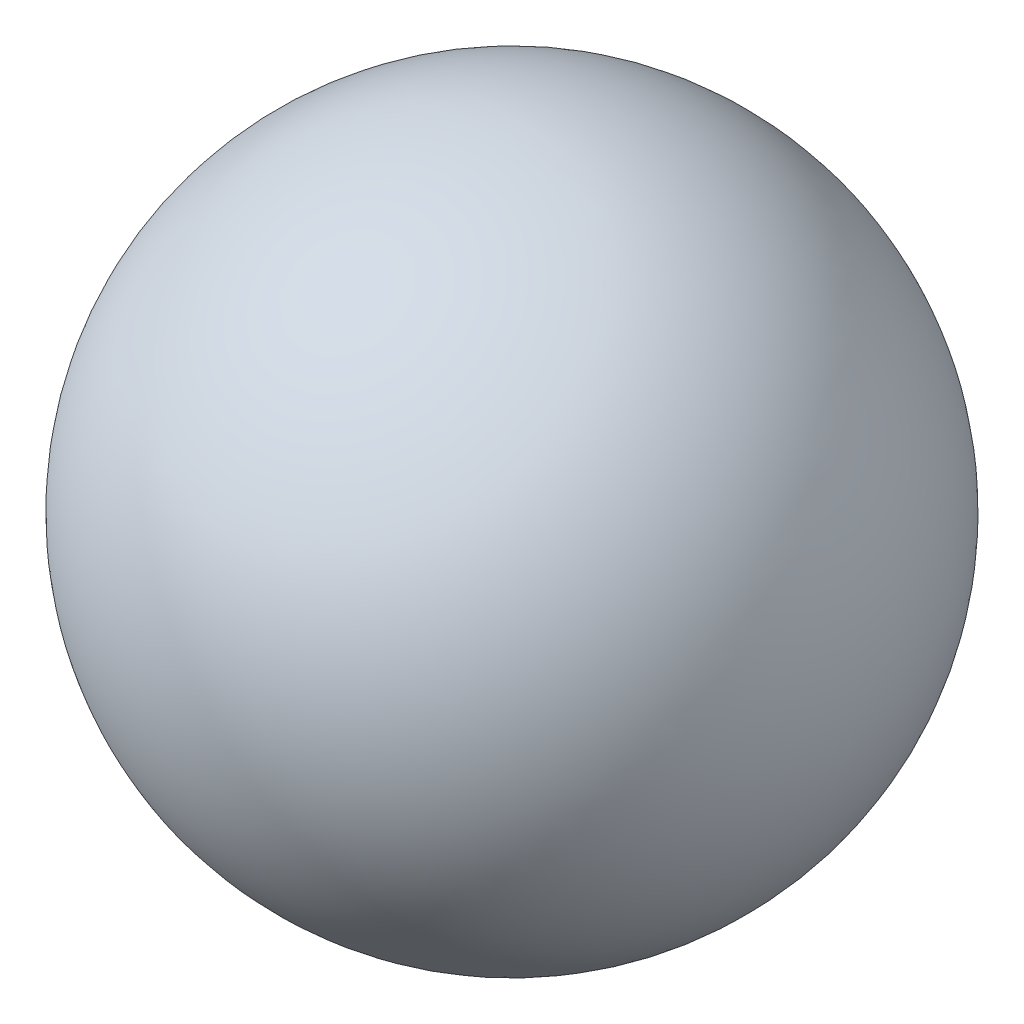
ISO-10303-21;
HEADER;
FILE_DESCRIPTION(('STEP AP214'),'2;1');
FILE_NAME('part.step','',(''),(''),'','','');
FILE_SCHEMA(('AUTOMOTIVE_DESIGN { 1 0 10303 214 1 1 1 1 }'));
ENDSEC;
DATA;
#1=APPLICATION_CONTEXT('core data for automotive mechanical design processes');
#2=APPLICATION_PROTOCOL_DEFINITION('international standard','automotive_design',2000,#1);
#3=PRODUCT_CONTEXT('',#1,'mechanical');
#4=PRODUCT('Part','Part','',(#3));
#5=PRODUCT_RELATED_PRODUCT_CATEGORY('part','',(#4));
#6=PRODUCT_DEFINITION_FORMATION('','',#4);
#7=PRODUCT_DEFINITION_CONTEXT('part definition',#1,'design');
#8=PRODUCT_DEFINITION('design','',#6,#7);
#9=PRODUCT_DEFINITION_SHAPE('','',#8);
#10=(LENGTH_UNIT() NAMED_UNIT(*) SI_UNIT(.MILLI.,.METRE.));
#11=(NAMED_UNIT(*) PLANE_ANGLE_UNIT() SI_UNIT($,.RADIAN.));
#12=(NAMED_UNIT(*) SI_UNIT($,.STERADIAN.) SOLID_ANGLE_UNIT());
#13=UNCERTAINTY_MEASURE_WITH_UNIT(LENGTH_MEASURE(1.E-05),#10,'distance_accuracy_value','');
#14=(GEOMETRIC_REPRESENTATION_CONTEXT(3) GLOBAL_UNCERTAINTY_ASSIGNED_CONTEXT((#13)) GLOBAL_UNIT_ASSIGNED_CONTEXT((#10,
#11,#12)) REPRESENTATION_CONTEXT('',''));
#15=CARTESIAN_POINT('',(0.,0.,0.));
#16=DIRECTION('',(0.,0.,1.));
#17=DIRECTION('',(1.,0.,0.));
#18=AXIS2_PLACEMENT_3D('',#15,#16,#17);
#19=CARTESIAN_POINT('',(0.,0.,0.));
#20=DIRECTION('',(0.,0.,-1.));
#21=DIRECTION('',(1.,0.,0.));
#22=AXIS2_PLACEMENT_3D('',#19,#20,#21);
#23=SPHERICAL_SURFACE('',#22,20.05);
#24=CARTESIAN_POINT('',(0.,0.,-20.05));
#25=VERTEX_POINT('',#24);
#26=VERTEX_LOOP('',#25);
#27=FACE_BOUND('',#26,.T.);
#28=ADVANCED_FACE('F34',(#27),#23,.T.);
#29=CLOSED_SHELL('',(#28));
#30=CARTESIAN_POINT('',(0.,0.,0.));
#31=DIRECTION('',(0.,0.,-1.));
#32=DIRECTION('',(1.,0.,0.));
#33=AXIS2_PLACEMENT_3D('',#30,#31,#32);
#34=SPHERICAL_SURFACE('',#33,19.5125);
#35=CARTESIAN_POINT('',(0.,0.,-19.5125));
#36=VERTEX_POINT('',#35);
#37=VERTEX_LOOP('',#36);
#38=FACE_BOUND('',#37,.T.);
#39=ADVANCED_FACE('F47',(#38),#34,.F.);
#40=CLOSED_SHELL('',(#39));
#41=ORIENTED_CLOSED_SHELL('',*,#40,.T.);
#42=BREP_WITH_VOIDS('B2',#29,(#41));
#43=ADVANCED_BREP_SHAPE_REPRESENTATION('',(#18,#42),#14);
#44=SHAPE_DEFINITION_REPRESENTATION(#9,#43);
ENDSEC;
END-ISO-10303-21;
